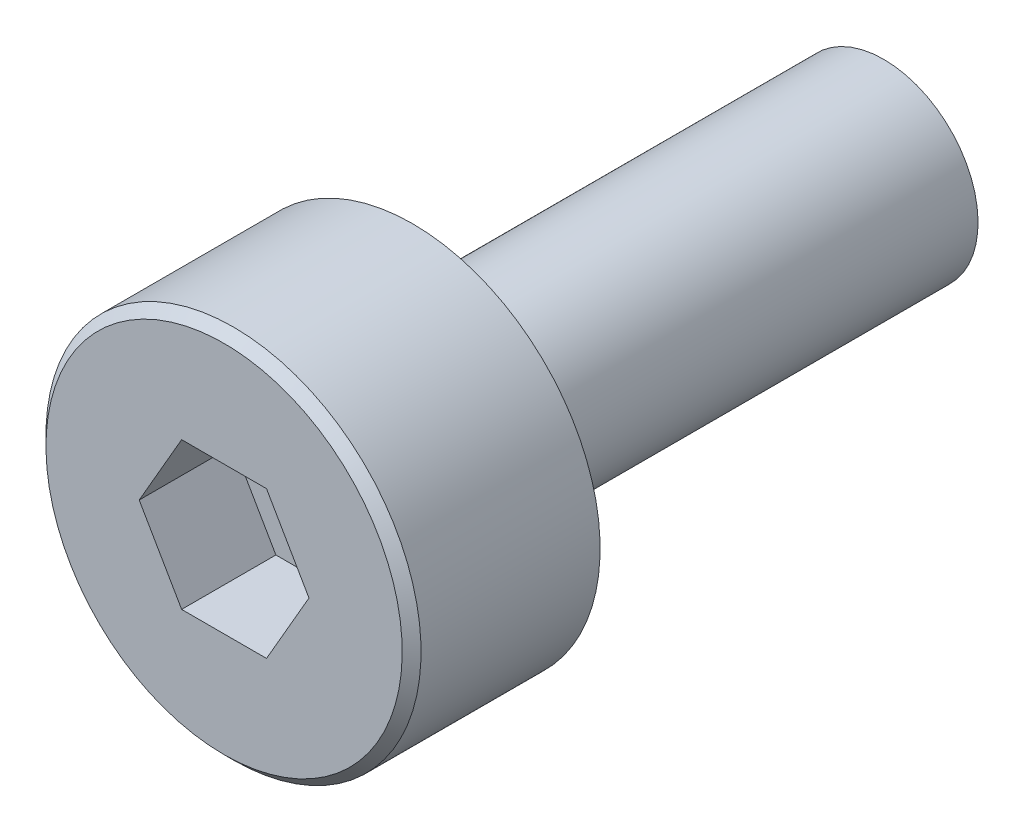
ISO-10303-21;
HEADER;
FILE_DESCRIPTION(('STEP AP214'),'2;1');
FILE_NAME('part.step','',(''),(''),'','','');
FILE_SCHEMA(('AUTOMOTIVE_DESIGN { 1 0 10303 214 1 1 1 1 }'));
ENDSEC;
DATA;
#1=APPLICATION_CONTEXT('core data for automotive mechanical design processes');
#2=APPLICATION_PROTOCOL_DEFINITION('international standard','automotive_design',2000,#1);
#3=PRODUCT_CONTEXT('',#1,'mechanical');
#4=PRODUCT('Part','Part','',(#3));
#5=PRODUCT_RELATED_PRODUCT_CATEGORY('part','',(#4));
#6=PRODUCT_DEFINITION_FORMATION('','',#4);
#7=PRODUCT_DEFINITION_CONTEXT('part definition',#1,'design');
#8=PRODUCT_DEFINITION('design','',#6,#7);
#9=PRODUCT_DEFINITION_SHAPE('','',#8);
#10=(LENGTH_UNIT() NAMED_UNIT(*) SI_UNIT(.MILLI.,.METRE.));
#11=(NAMED_UNIT(*) PLANE_ANGLE_UNIT() SI_UNIT($,.RADIAN.));
#12=(NAMED_UNIT(*) SI_UNIT($,.STERADIAN.) SOLID_ANGLE_UNIT());
#13=UNCERTAINTY_MEASURE_WITH_UNIT(LENGTH_MEASURE(1.E-05),#10,'distance_accuracy_value','');
#14=(GEOMETRIC_REPRESENTATION_CONTEXT(3) GLOBAL_UNCERTAINTY_ASSIGNED_CONTEXT((#13)) GLOBAL_UNIT_ASSIGNED_CONTEXT((#10,
#11,#12)) REPRESENTATION_CONTEXT('',''));
#15=CARTESIAN_POINT('',(0.,0.,0.));
#16=DIRECTION('',(0.,0.,1.));
#17=DIRECTION('',(1.,0.,0.));
#18=AXIS2_PLACEMENT_3D('',#15,#16,#17);
#19=CARTESIAN_POINT('',(0.,0.,0.));
#20=DIRECTION('',(0.,0.,1.));
#21=DIRECTION('',(0.,-1.,0.));
#22=AXIS2_PLACEMENT_3D('',#19,#20,#21);
#23=PLANE('',#22);
#24=CARTESIAN_POINT('',(0.,0.,0.));
#25=DIRECTION('',(0.,0.,1.));
#26=DIRECTION('',(0.,-1.,0.));
#27=AXIS2_PLACEMENT_3D('',#24,#25,#26);
#28=CIRCLE('',#27,1.89);
#29=CARTESIAN_POINT('',(0.,-1.89,0.));
#30=VERTEX_POINT('',#29);
#31=EDGE_CURVE('E11',#30,#30,#28,.T.);
#32=ORIENTED_EDGE('',*,*,#31,.T.);
#33=EDGE_LOOP('',(#32));
#34=FACE_BOUND('',#33,.T.);
#35=DIRECTION('',(-0.5,0.866025403784439,0.));
#36=VECTOR('',#35,1.);
#37=CARTESIAN_POINT('',(0.900666419935816,0.,0.));
#38=LINE('',#37,#36);
#39=CARTESIAN_POINT('',(0.900666419935816,0.,0.));
#40=VERTEX_POINT('',#39);
#41=CARTESIAN_POINT('',(0.450333209967908,0.78,0.));
#42=VERTEX_POINT('',#41);
#43=EDGE_CURVE('E60',#40,#42,#38,.T.);
#44=ORIENTED_EDGE('',*,*,#43,.F.);
#45=DIRECTION('',(0.5,0.866025403784439,0.));
#46=VECTOR('',#45,1.);
#47=CARTESIAN_POINT('',(0.450333209967908,-0.78,0.));
#48=LINE('',#47,#46);
#49=CARTESIAN_POINT('',(0.450333209967908,-0.78,0.));
#50=VERTEX_POINT('',#49);
#51=EDGE_CURVE('E143',#50,#40,#48,.T.);
#52=ORIENTED_EDGE('',*,*,#51,.F.);
#53=DIRECTION('',(1.,0.,0.));
#54=VECTOR('',#53,1.);
#55=CARTESIAN_POINT('',(-0.450333209967908,-0.78,0.));
#56=LINE('',#55,#54);
#57=CARTESIAN_POINT('',(-0.450333209967908,-0.78,0.));
#58=VERTEX_POINT('',#57);
#59=EDGE_CURVE('E141',#58,#50,#56,.T.);
#60=ORIENTED_EDGE('',*,*,#59,.F.);
#61=DIRECTION('',(0.5,-0.866025403784439,0.));
#62=VECTOR('',#61,1.);
#63=CARTESIAN_POINT('',(-0.900666419935816,0.,0.));
#64=LINE('',#63,#62);
#65=CARTESIAN_POINT('',(-0.900666419935816,0.,0.));
#66=VERTEX_POINT('',#65);
#67=EDGE_CURVE('E108',#66,#58,#64,.T.);
#68=ORIENTED_EDGE('',*,*,#67,.F.);
#69=DIRECTION('',(-0.5,-0.866025403784439,0.));
#70=VECTOR('',#69,1.);
#71=CARTESIAN_POINT('',(-0.450333209967908,0.78,0.));
#72=LINE('',#71,#70);
#73=CARTESIAN_POINT('',(-0.450333209967908,0.78,0.));
#74=VERTEX_POINT('',#73);
#75=EDGE_CURVE('E137',#74,#66,#72,.T.);
#76=ORIENTED_EDGE('',*,*,#75,.F.);
#77=DIRECTION('',(-1.,0.,0.));
#78=VECTOR('',#77,1.);
#79=CARTESIAN_POINT('',(0.450333209967908,0.78,0.));
#80=LINE('',#79,#78);
#81=EDGE_CURVE('E134',#42,#74,#80,.T.);
#82=ORIENTED_EDGE('',*,*,#81,.F.);
#83=EDGE_LOOP('',(#44,#52,#60,#68,#76,#82));
#84=FACE_BOUND('',#83,.T.);
#85=ADVANCED_FACE('F44',(#34,#84),#23,.T.);
#86=CARTESIAN_POINT('',(0.,0.,-7.));
#87=DIRECTION('',(0.,0.,-1.));
#88=DIRECTION('',(0.,1.,0.));
#89=AXIS2_PLACEMENT_3D('',#86,#87,#88);
#90=CYLINDRICAL_SURFACE('',#89,1.99);
#91=CARTESIAN_POINT('',(0.,0.,-0.1));
#92=DIRECTION('',(0.,0.,1.));
#93=DIRECTION('',(0.,-1.,0.));
#94=AXIS2_PLACEMENT_3D('',#91,#92,#93);
#95=CIRCLE('',#94,1.99);
#96=CARTESIAN_POINT('',(0.,-1.99,-0.1));
#97=VERTEX_POINT('',#96);
#98=EDGE_CURVE('E53',#97,#97,#95,.F.);
#99=ORIENTED_EDGE('',*,*,#98,.T.);
#100=EDGE_LOOP('',(#99));
#101=FACE_BOUND('',#100,.T.);
#102=CARTESIAN_POINT('',(0.,0.,-2.));
#103=DIRECTION('',(0.,0.,-1.));
#104=DIRECTION('',(0.,1.,0.));
#105=AXIS2_PLACEMENT_3D('',#102,#103,#104);
#106=CIRCLE('',#105,1.99);
#107=CARTESIAN_POINT('',(0.,1.99,-2.));
#108=VERTEX_POINT('',#107);
#109=EDGE_CURVE('E158',#108,#108,#106,.T.);
#110=ORIENTED_EDGE('',*,*,#109,.F.);
#111=EDGE_LOOP('',(#110));
#112=FACE_BOUND('',#111,.T.);
#113=ADVANCED_FACE('F163',(#101,#112),#90,.T.);
#114=CARTESIAN_POINT('',(0.,1.99,-2.));
#115=DIRECTION('',(0.,0.,-1.));
#116=DIRECTION('',(0.,1.,0.));
#117=AXIS2_PLACEMENT_3D('',#114,#115,#116);
#118=PLANE('',#117);
#119=ORIENTED_EDGE('',*,*,#109,.T.);
#120=EDGE_LOOP('',(#119));
#121=FACE_BOUND('',#120,.T.);
#122=CARTESIAN_POINT('',(0.,0.,-2.));
#123=DIRECTION('',(0.,0.,-1.));
#124=DIRECTION('',(0.,1.,0.));
#125=AXIS2_PLACEMENT_3D('',#122,#123,#124);
#126=CIRCLE('',#125,0.999999999999999);
#127=CARTESIAN_POINT('',(0.,0.999999999999999,-2.));
#128=VERTEX_POINT('',#127);
#129=EDGE_CURVE('E155',#128,#128,#126,.T.);
#130=ORIENTED_EDGE('',*,*,#129,.F.);
#131=EDGE_LOOP('',(#130));
#132=FACE_BOUND('',#131,.T.);
#133=ADVANCED_FACE('F179',(#121,#132),#118,.T.);
#134=CARTESIAN_POINT('',(0.,0.,-7.));
#135=DIRECTION('',(0.,0.,-1.));
#136=DIRECTION('',(0.,1.,0.));
#137=AXIS2_PLACEMENT_3D('',#134,#135,#136);
#138=CYLINDRICAL_SURFACE('',#137,0.999999999999999);
#139=ORIENTED_EDGE('',*,*,#129,.T.);
#140=EDGE_LOOP('',(#139));
#141=FACE_BOUND('',#140,.T.);
#142=CARTESIAN_POINT('',(0.,0.,-7.));
#143=DIRECTION('',(0.,0.,-1.));
#144=DIRECTION('',(0.,1.,0.));
#145=AXIS2_PLACEMENT_3D('',#142,#143,#144);
#146=CIRCLE('',#145,0.999999999999999);
#147=CARTESIAN_POINT('',(0.,0.999999999999999,-7.));
#148=VERTEX_POINT('',#147);
#149=EDGE_CURVE('E147',#148,#148,#146,.T.);
#150=ORIENTED_EDGE('',*,*,#149,.F.);
#151=EDGE_LOOP('',(#150));
#152=FACE_BOUND('',#151,.T.);
#153=ADVANCED_FACE('F185',(#141,#152),#138,.T.);
#154=CARTESIAN_POINT('',(0.,0.999999999999999,-7.));
#155=DIRECTION('',(0.,0.,-1.));
#156=DIRECTION('',(0.,1.,0.));
#157=AXIS2_PLACEMENT_3D('',#154,#155,#156);
#158=PLANE('',#157);
#159=ORIENTED_EDGE('',*,*,#149,.T.);
#160=EDGE_LOOP('',(#159));
#161=FACE_BOUND('',#160,.T.);
#162=ADVANCED_FACE('F189',(#161),#158,.T.);
#163=CARTESIAN_POINT('',(0.900666419935816,0.,-1.));
#164=DIRECTION('',(0.866025403784439,0.5,0.));
#165=DIRECTION('',(-0.5,0.866025403784439,0.));
#166=AXIS2_PLACEMENT_3D('',#163,#164,#165);
#167=PLANE('',#166);
#168=ORIENTED_EDGE('',*,*,#43,.T.);
#169=DIRECTION('',(0.,0.,1.));
#170=VECTOR('',#169,1.);
#171=CARTESIAN_POINT('',(0.450333209967908,0.78,-1.));
#172=LINE('',#171,#170);
#173=CARTESIAN_POINT('',(0.450333209967908,0.78,-1.));
#174=VERTEX_POINT('',#173);
#175=EDGE_CURVE('E90',#174,#42,#172,.T.);
#176=ORIENTED_EDGE('',*,*,#175,.F.);
#177=DIRECTION('',(-0.5,0.866025403784439,0.));
#178=VECTOR('',#177,1.);
#179=CARTESIAN_POINT('',(0.900666419935816,0.,-1.));
#180=LINE('',#179,#178);
#181=CARTESIAN_POINT('',(0.900666419935816,0.,-1.));
#182=VERTEX_POINT('',#181);
#183=EDGE_CURVE('E145',#182,#174,#180,.T.);
#184=ORIENTED_EDGE('',*,*,#183,.F.);
#185=DIRECTION('',(0.,0.,1.));
#186=VECTOR('',#185,1.);
#187=CARTESIAN_POINT('',(0.900666419935816,0.,-1.));
#188=LINE('',#187,#186);
#189=EDGE_CURVE('E68',#182,#40,#188,.T.);
#190=ORIENTED_EDGE('',*,*,#189,.T.);
#191=EDGE_LOOP('',(#168,#176,#184,#190));
#192=FACE_BOUND('',#191,.T.);
#193=ADVANCED_FACE('F193',(#192),#167,.F.);
#194=CARTESIAN_POINT('',(0.450333209967908,-0.78,-1.));
#195=DIRECTION('',(0.866025403784439,-0.5,0.));
#196=DIRECTION('',(0.5,0.866025403784439,0.));
#197=AXIS2_PLACEMENT_3D('',#194,#195,#196);
#198=PLANE('',#197);
#199=ORIENTED_EDGE('',*,*,#51,.T.);
#200=ORIENTED_EDGE('',*,*,#189,.F.);
#201=DIRECTION('',(0.5,0.866025403784439,0.));
#202=VECTOR('',#201,1.);
#203=CARTESIAN_POINT('',(0.450333209967908,-0.78,-1.));
#204=LINE('',#203,#202);
#205=CARTESIAN_POINT('',(0.450333209967908,-0.78,-1.));
#206=VERTEX_POINT('',#205);
#207=EDGE_CURVE('E120',#206,#182,#204,.T.);
#208=ORIENTED_EDGE('',*,*,#207,.F.);
#209=DIRECTION('',(0.,0.,1.));
#210=VECTOR('',#209,1.);
#211=CARTESIAN_POINT('',(0.450333209967908,-0.78,-1.));
#212=LINE('',#211,#210);
#213=EDGE_CURVE('E112',#206,#50,#212,.T.);
#214=ORIENTED_EDGE('',*,*,#213,.T.);
#215=EDGE_LOOP('',(#199,#200,#208,#214));
#216=FACE_BOUND('',#215,.T.);
#217=ADVANCED_FACE('F197',(#216),#198,.F.);
#218=CARTESIAN_POINT('',(-0.450333209967908,-0.78,-1.));
#219=DIRECTION('',(0.,-1.,0.));
#220=DIRECTION('',(0.,0.,-1.));
#221=AXIS2_PLACEMENT_3D('',#218,#219,#220);
#222=PLANE('',#221);
#223=ORIENTED_EDGE('',*,*,#59,.T.);
#224=ORIENTED_EDGE('',*,*,#213,.F.);
#225=DIRECTION('',(1.,0.,0.));
#226=VECTOR('',#225,1.);
#227=CARTESIAN_POINT('',(-0.450333209967908,-0.78,-1.));
#228=LINE('',#227,#226);
#229=CARTESIAN_POINT('',(-0.450333209967908,-0.78,-1.));
#230=VERTEX_POINT('',#229);
#231=EDGE_CURVE('E116',#230,#206,#228,.T.);
#232=ORIENTED_EDGE('',*,*,#231,.F.);
#233=DIRECTION('',(0.,0.,1.));
#234=VECTOR('',#233,1.);
#235=CARTESIAN_POINT('',(-0.450333209967908,-0.78,-1.));
#236=LINE('',#235,#234);
#237=EDGE_CURVE('E101',#230,#58,#236,.T.);
#238=ORIENTED_EDGE('',*,*,#237,.T.);
#239=EDGE_LOOP('',(#223,#224,#232,#238));
#240=FACE_BOUND('',#239,.T.);
#241=ADVANCED_FACE('F117',(#240),#222,.F.);
#242=CARTESIAN_POINT('',(-0.900666419935816,0.,-1.));
#243=DIRECTION('',(-0.866025403784438,-0.5,0.));
#244=DIRECTION('',(0.5,-0.866025403784439,0.));
#245=AXIS2_PLACEMENT_3D('',#242,#243,#244);
#246=PLANE('',#245);
#247=ORIENTED_EDGE('',*,*,#67,.T.);
#248=ORIENTED_EDGE('',*,*,#237,.F.);
#249=DIRECTION('',(0.5,-0.866025403784439,0.));
#250=VECTOR('',#249,1.);
#251=CARTESIAN_POINT('',(-0.900666419935816,0.,-1.));
#252=LINE('',#251,#250);
#253=CARTESIAN_POINT('',(-0.900666419935816,0.,-1.));
#254=VERTEX_POINT('',#253);
#255=EDGE_CURVE('E105',#254,#230,#252,.T.);
#256=ORIENTED_EDGE('',*,*,#255,.F.);
#257=DIRECTION('',(0.,0.,1.));
#258=VECTOR('',#257,1.);
#259=CARTESIAN_POINT('',(-0.900666419935816,0.,-1.));
#260=LINE('',#259,#258);
#261=EDGE_CURVE('E113',#254,#66,#260,.T.);
#262=ORIENTED_EDGE('',*,*,#261,.T.);
#263=EDGE_LOOP('',(#247,#248,#256,#262));
#264=FACE_BOUND('',#263,.T.);
#265=ADVANCED_FACE('F103',(#264),#246,.F.);
#266=CARTESIAN_POINT('',(-0.450333209967908,0.78,-1.));
#267=DIRECTION('',(-0.866025403784439,0.5,0.));
#268=DIRECTION('',(-0.5,-0.866025403784439,0.));
#269=AXIS2_PLACEMENT_3D('',#266,#267,#268);
#270=PLANE('',#269);
#271=ORIENTED_EDGE('',*,*,#75,.T.);
#272=ORIENTED_EDGE('',*,*,#261,.F.);
#273=DIRECTION('',(-0.5,-0.866025403784439,0.));
#274=VECTOR('',#273,1.);
#275=CARTESIAN_POINT('',(-0.450333209967908,0.78,-1.));
#276=LINE('',#275,#274);
#277=CARTESIAN_POINT('',(-0.450333209967908,0.78,-1.));
#278=VERTEX_POINT('',#277);
#279=EDGE_CURVE('E126',#278,#254,#276,.T.);
#280=ORIENTED_EDGE('',*,*,#279,.F.);
#281=DIRECTION('',(0.,0.,1.));
#282=VECTOR('',#281,1.);
#283=CARTESIAN_POINT('',(-0.450333209967908,0.78,-1.));
#284=LINE('',#283,#282);
#285=EDGE_CURVE('E150',#278,#74,#284,.T.);
#286=ORIENTED_EDGE('',*,*,#285,.T.);
#287=EDGE_LOOP('',(#271,#272,#280,#286));
#288=FACE_BOUND('',#287,.T.);
#289=ADVANCED_FACE('F200',(#288),#270,.F.);
#290=CARTESIAN_POINT('',(0.450333209967908,0.78,-1.));
#291=DIRECTION('',(0.,1.,0.));
#292=DIRECTION('',(-1.,0.,0.));
#293=AXIS2_PLACEMENT_3D('',#290,#291,#292);
#294=PLANE('',#293);
#295=ORIENTED_EDGE('',*,*,#81,.T.);
#296=ORIENTED_EDGE('',*,*,#285,.F.);
#297=DIRECTION('',(-1.,0.,0.));
#298=VECTOR('',#297,1.);
#299=CARTESIAN_POINT('',(0.450333209967908,0.78,-1.));
#300=LINE('',#299,#298);
#301=EDGE_CURVE('E128',#174,#278,#300,.T.);
#302=ORIENTED_EDGE('',*,*,#301,.F.);
#303=ORIENTED_EDGE('',*,*,#175,.T.);
#304=EDGE_LOOP('',(#295,#296,#302,#303));
#305=FACE_BOUND('',#304,.T.);
#306=ADVANCED_FACE('F171',(#305),#294,.F.);
#307=CARTESIAN_POINT('',(0.,0.,-1.));
#308=DIRECTION('',(0.,0.,1.));
#309=DIRECTION('',(1.,0.,0.));
#310=AXIS2_PLACEMENT_3D('',#307,#308,#309);
#311=PLANE('',#310);
#312=ORIENTED_EDGE('',*,*,#183,.T.);
#313=ORIENTED_EDGE('',*,*,#301,.T.);
#314=ORIENTED_EDGE('',*,*,#279,.T.);
#315=ORIENTED_EDGE('',*,*,#255,.T.);
#316=ORIENTED_EDGE('',*,*,#231,.T.);
#317=ORIENTED_EDGE('',*,*,#207,.T.);
#318=EDGE_LOOP('',(#312,#313,#314,#315,#316,#317));
#319=FACE_BOUND('',#318,.T.);
#320=ADVANCED_FACE('F123',(#319),#311,.T.);
#321=CARTESIAN_POINT('',(0.,0.,-0.1));
#322=DIRECTION('',(0.,0.,-1.));
#323=DIRECTION('',(0.,1.,0.));
#324=AXIS2_PLACEMENT_3D('',#321,#322,#323);
#325=CONICAL_SURFACE('',#324,1.99,0.785398163397448);
#326=ORIENTED_EDGE('',*,*,#31,.F.);
#327=EDGE_LOOP('',(#326));
#328=FACE_BOUND('',#327,.T.);
#329=ORIENTED_EDGE('',*,*,#98,.F.);
#330=EDGE_LOOP('',(#329));
#331=FACE_BOUND('',#330,.T.);
#332=ADVANCED_FACE('F47',(#328,#331),#325,.T.);
#333=CLOSED_SHELL('',(#85,#113,#133,#153,#162,#193,#217,#241,#265,#289,#306,#320,#332));
#334=MANIFOLD_SOLID_BREP('B2',#333);
#335=ADVANCED_BREP_SHAPE_REPRESENTATION('',(#18,#334),#14);
#336=SHAPE_DEFINITION_REPRESENTATION(#9,#335);
ENDSEC;
END-ISO-10303-21;
